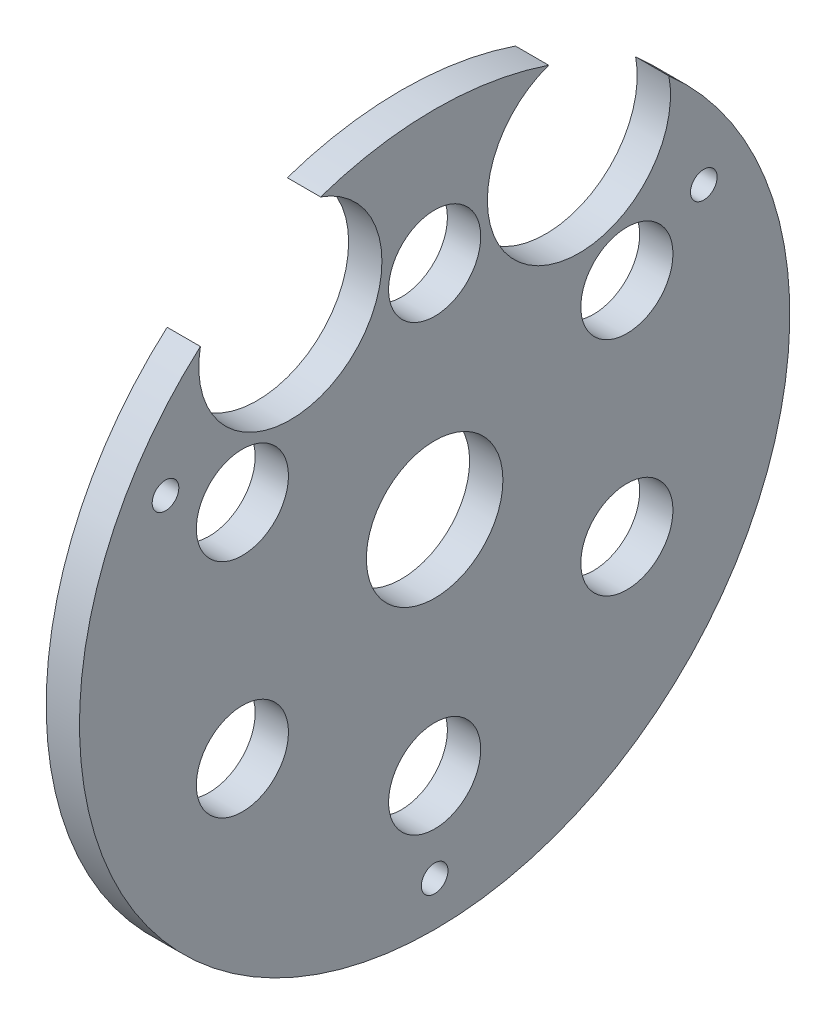
ISO-10303-21;
HEADER;
FILE_DESCRIPTION(('STEP AP214'),'2;1');
FILE_NAME('part.step','',(''),(''),'','','');
FILE_SCHEMA(('AUTOMOTIVE_DESIGN { 1 0 10303 214 1 1 1 1 }'));
ENDSEC;
DATA;
#1=APPLICATION_CONTEXT('core data for automotive mechanical design processes');
#2=APPLICATION_PROTOCOL_DEFINITION('international standard','automotive_design',2000,#1);
#3=PRODUCT_CONTEXT('',#1,'mechanical');
#4=PRODUCT('Part','Part','',(#3));
#5=PRODUCT_RELATED_PRODUCT_CATEGORY('part','',(#4));
#6=PRODUCT_DEFINITION_FORMATION('','',#4);
#7=PRODUCT_DEFINITION_CONTEXT('part definition',#1,'design');
#8=PRODUCT_DEFINITION('design','',#6,#7);
#9=PRODUCT_DEFINITION_SHAPE('','',#8);
#10=(LENGTH_UNIT() NAMED_UNIT(*) SI_UNIT(.MILLI.,.METRE.));
#11=(NAMED_UNIT(*) PLANE_ANGLE_UNIT() SI_UNIT($,.RADIAN.));
#12=(NAMED_UNIT(*) SI_UNIT($,.STERADIAN.) SOLID_ANGLE_UNIT());
#13=UNCERTAINTY_MEASURE_WITH_UNIT(LENGTH_MEASURE(1.E-05),#10,'distance_accuracy_value','');
#14=(GEOMETRIC_REPRESENTATION_CONTEXT(3) GLOBAL_UNCERTAINTY_ASSIGNED_CONTEXT((#13)) GLOBAL_UNIT_ASSIGNED_CONTEXT((#10,
#11,#12)) REPRESENTATION_CONTEXT('',''));
#15=CARTESIAN_POINT('',(0.,0.,0.));
#16=DIRECTION('',(0.,0.,1.));
#17=DIRECTION('',(1.,0.,0.));
#18=AXIS2_PLACEMENT_3D('',#15,#16,#17);
#19=CARTESIAN_POINT('',(-60.,0.,0.));
#20=DIRECTION('',(-1.,0.,0.));
#21=DIRECTION('',(0.,0.,1.));
#22=AXIS2_PLACEMENT_3D('',#19,#20,#21);
#23=CYLINDRICAL_SURFACE('',#22,32.);
#24=DIRECTION('',(-1.,0.,0.));
#25=VECTOR('',#24,1.);
#26=CARTESIAN_POINT('',(-15.5,30.3045876042156,10.2777414901535));
#27=LINE('',#26,#25);
#28=CARTESIAN_POINT('',(-14.,30.3045876042156,10.2777414901535));
#29=VERTEX_POINT('',#28);
#30=CARTESIAN_POINT('',(-17.,30.3045876042156,10.2777414901535));
#31=VERTEX_POINT('',#30);
#32=EDGE_CURVE('E11',#29,#31,#27,.T.);
#33=ORIENTED_EDGE('',*,*,#32,.F.);
#34=CARTESIAN_POINT('',(-14.,0.,0.));
#35=DIRECTION('',(-1.,0.,0.));
#36=DIRECTION('',(0.,0.,1.));
#37=AXIS2_PLACEMENT_3D('',#34,#35,#36);
#38=CIRCLE('',#37,32.);
#39=CARTESIAN_POINT('',(-14.,30.3045876042156,-10.2777414901535));
#40=VERTEX_POINT('',#39);
#41=EDGE_CURVE('E113',#29,#40,#38,.T.);
#42=ORIENTED_EDGE('',*,*,#41,.T.);
#43=DIRECTION('',(-1.,0.,0.));
#44=VECTOR('',#43,1.);
#45=CARTESIAN_POINT('',(-15.5,30.3045876042156,-10.2777414901535));
#46=LINE('',#45,#44);
#47=CARTESIAN_POINT('',(-17.,30.3045876042156,-10.2777414901535));
#48=VERTEX_POINT('',#47);
#49=EDGE_CURVE('E85',#48,#40,#46,.F.);
#50=ORIENTED_EDGE('',*,*,#49,.F.);
#51=CARTESIAN_POINT('',(-17.,0.,0.));
#52=DIRECTION('',(-1.,0.,0.));
#53=DIRECTION('',(0.,0.,1.));
#54=AXIS2_PLACEMENT_3D('',#51,#52,#53);
#55=CIRCLE('',#54,32.);
#56=EDGE_CURVE('E93',#31,#48,#55,.T.);
#57=ORIENTED_EDGE('',*,*,#56,.F.);
#58=EDGE_LOOP('',(#33,#42,#50,#57));
#59=FACE_BOUND('',#58,.T.);
#60=ADVANCED_FACE('F37',(#59),#23,.T.);
#61=DIRECTION('',(-1.,0.,0.));
#62=VECTOR('',#61,1.);
#63=CARTESIAN_POINT('',(-15.5,24.0530790261101,21.1056719713849));
#64=LINE('',#63,#62);
#65=CARTESIAN_POINT('',(-17.,24.0530790261101,21.1056719713849));
#66=VERTEX_POINT('',#65);
#67=CARTESIAN_POINT('',(-14.,24.0530790261101,21.1056719713849));
#68=VERTEX_POINT('',#67);
#69=EDGE_CURVE('E46',#66,#68,#64,.F.);
#70=ORIENTED_EDGE('',*,*,#69,.F.);
#71=CARTESIAN_POINT('',(-17.,24.0530790261101,-21.1056719713849));
#72=VERTEX_POINT('',#71);
#73=EDGE_CURVE('E91',#72,#66,#55,.T.);
#74=ORIENTED_EDGE('',*,*,#73,.F.);
#75=DIRECTION('',(-1.,0.,0.));
#76=VECTOR('',#75,1.);
#77=CARTESIAN_POINT('',(-15.5,24.0530790261101,-21.1056719713849));
#78=LINE('',#77,#76);
#79=CARTESIAN_POINT('',(-14.,24.0530790261101,-21.1056719713849));
#80=VERTEX_POINT('',#79);
#81=EDGE_CURVE('E76',#80,#72,#78,.T.);
#82=ORIENTED_EDGE('',*,*,#81,.F.);
#83=EDGE_CURVE('E104',#80,#68,#38,.T.);
#84=ORIENTED_EDGE('',*,*,#83,.T.);
#85=EDGE_LOOP('',(#70,#74,#82,#84));
#86=FACE_BOUND('',#85,.T.);
#87=ADVANCED_FACE('F97',(#86),#23,.T.);
#88=CARTESIAN_POINT('',(-17.,32.,0.));
#89=DIRECTION('',(1.,0.,0.));
#90=DIRECTION('',(0.,0.,-1.));
#91=AXIS2_PLACEMENT_3D('',#88,#89,#90);
#92=PLANE('',#91);
#93=CARTESIAN_POINT('',(-17.,14.,24.2487113059643));
#94=DIRECTION('',(1.,0.,0.));
#95=DIRECTION('',(0.,0.,-1.));
#96=AXIS2_PLACEMENT_3D('',#93,#94,#95);
#97=CIRCLE('',#96,1.2);
#98=CARTESIAN_POINT('',(-17.,14.,23.0487113059643));
#99=VERTEX_POINT('',#98);
#100=EDGE_CURVE('E219',#99,#99,#97,.T.);
#101=ORIENTED_EDGE('',*,*,#100,.T.);
#102=EDGE_LOOP('',(#101));
#103=FACE_BOUND('',#102,.T.);
#104=CARTESIAN_POINT('',(-17.,-28.,0.));
#105=DIRECTION('',(1.,0.,0.));
#106=DIRECTION('',(0.,0.,-1.));
#107=AXIS2_PLACEMENT_3D('',#104,#105,#106);
#108=CIRCLE('',#107,1.2);
#109=CARTESIAN_POINT('',(-17.,-28.,-1.2));
#110=VERTEX_POINT('',#109);
#111=EDGE_CURVE('E213',#110,#110,#108,.T.);
#112=ORIENTED_EDGE('',*,*,#111,.T.);
#113=EDGE_LOOP('',(#112));
#114=FACE_BOUND('',#113,.T.);
#115=CARTESIAN_POINT('',(-17.,14.,-24.2487113059643));
#116=DIRECTION('',(1.,0.,0.));
#117=DIRECTION('',(0.,0.,-1.));
#118=AXIS2_PLACEMENT_3D('',#115,#116,#117);
#119=CIRCLE('',#118,1.2);
#120=CARTESIAN_POINT('',(-17.,14.,-25.4487113059643));
#121=VERTEX_POINT('',#120);
#122=EDGE_CURVE('E136',#121,#121,#119,.T.);
#123=ORIENTED_EDGE('',*,*,#122,.T.);
#124=EDGE_LOOP('',(#123));
#125=FACE_BOUND('',#124,.T.);
#126=CARTESIAN_POINT('',(-17.,22.5166604983954,13.));
#127=DIRECTION('',(1.,0.,0.));
#128=DIRECTION('',(0.,0.,-1.));
#129=AXIS2_PLACEMENT_3D('',#126,#127,#128);
#130=CIRCLE('',#129,8.25);
#131=EDGE_CURVE('E60',#66,#31,#130,.T.);
#132=ORIENTED_EDGE('',*,*,#131,.T.);
#133=ORIENTED_EDGE('',*,*,#56,.T.);
#134=CARTESIAN_POINT('',(-17.,22.5166604983954,-13.));
#135=DIRECTION('',(1.,0.,0.));
#136=DIRECTION('',(0.,0.,-1.));
#137=AXIS2_PLACEMENT_3D('',#134,#135,#136);
#138=CIRCLE('',#137,8.25);
#139=EDGE_CURVE('E53',#48,#72,#138,.T.);
#140=ORIENTED_EDGE('',*,*,#139,.T.);
#141=ORIENTED_EDGE('',*,*,#73,.T.);
#142=EDGE_LOOP('',(#132,#133,#140,#141));
#143=FACE_BOUND('',#142,.T.);
#144=CARTESIAN_POINT('',(-17.,10.,-17.3205080756888));
#145=DIRECTION('',(1.,0.,0.));
#146=DIRECTION('',(0.,0.,-1.));
#147=AXIS2_PLACEMENT_3D('',#144,#145,#146);
#148=CIRCLE('',#147,4.15);
#149=CARTESIAN_POINT('',(-17.,10.,-21.4705080756888));
#150=VERTEX_POINT('',#149);
#151=EDGE_CURVE('E126',#150,#150,#148,.T.);
#152=ORIENTED_EDGE('',*,*,#151,.T.);
#153=EDGE_LOOP('',(#152));
#154=FACE_BOUND('',#153,.T.);
#155=CARTESIAN_POINT('',(-17.,-10.,-17.3205080756888));
#156=DIRECTION('',(1.,0.,0.));
#157=DIRECTION('',(0.,0.,-1.));
#158=AXIS2_PLACEMENT_3D('',#155,#156,#157);
#159=CIRCLE('',#158,4.15);
#160=CARTESIAN_POINT('',(-17.,-10.,-21.4705080756888));
#161=VERTEX_POINT('',#160);
#162=EDGE_CURVE('E175',#161,#161,#159,.T.);
#163=ORIENTED_EDGE('',*,*,#162,.T.);
#164=EDGE_LOOP('',(#163));
#165=FACE_BOUND('',#164,.T.);
#166=CARTESIAN_POINT('',(-17.,-20.,0.));
#167=DIRECTION('',(1.,0.,0.));
#168=DIRECTION('',(0.,0.,-1.));
#169=AXIS2_PLACEMENT_3D('',#166,#167,#168);
#170=CIRCLE('',#169,4.15);
#171=CARTESIAN_POINT('',(-17.,-20.,-4.15));
#172=VERTEX_POINT('',#171);
#173=EDGE_CURVE('E168',#172,#172,#170,.T.);
#174=ORIENTED_EDGE('',*,*,#173,.T.);
#175=EDGE_LOOP('',(#174));
#176=FACE_BOUND('',#175,.T.);
#177=CARTESIAN_POINT('',(-17.,-10.,17.3205080756888));
#178=DIRECTION('',(1.,0.,0.));
#179=DIRECTION('',(0.,0.,-1.));
#180=AXIS2_PLACEMENT_3D('',#177,#178,#179);
#181=CIRCLE('',#180,4.15);
#182=CARTESIAN_POINT('',(-17.,-10.,13.1705080756888));
#183=VERTEX_POINT('',#182);
#184=EDGE_CURVE('E160',#183,#183,#181,.T.);
#185=ORIENTED_EDGE('',*,*,#184,.T.);
#186=EDGE_LOOP('',(#185));
#187=FACE_BOUND('',#186,.T.);
#188=CARTESIAN_POINT('',(-17.,10.,17.3205080756888));
#189=DIRECTION('',(1.,0.,0.));
#190=DIRECTION('',(0.,0.,-1.));
#191=AXIS2_PLACEMENT_3D('',#188,#189,#190);
#192=CIRCLE('',#191,4.15);
#193=CARTESIAN_POINT('',(-17.,10.,13.1705080756888));
#194=VERTEX_POINT('',#193);
#195=EDGE_CURVE('E153',#194,#194,#192,.T.);
#196=ORIENTED_EDGE('',*,*,#195,.T.);
#197=EDGE_LOOP('',(#196));
#198=FACE_BOUND('',#197,.T.);
#199=CARTESIAN_POINT('',(-17.,20.,0.));
#200=DIRECTION('',(1.,0.,0.));
#201=DIRECTION('',(0.,0.,-1.));
#202=AXIS2_PLACEMENT_3D('',#199,#200,#201);
#203=CIRCLE('',#202,4.15);
#204=CARTESIAN_POINT('',(-17.,20.,-4.15));
#205=VERTEX_POINT('',#204);
#206=EDGE_CURVE('E145',#205,#205,#203,.T.);
#207=ORIENTED_EDGE('',*,*,#206,.T.);
#208=EDGE_LOOP('',(#207));
#209=FACE_BOUND('',#208,.T.);
#210=CARTESIAN_POINT('',(-17.,0.,0.));
#211=DIRECTION('',(1.,0.,0.));
#212=DIRECTION('',(0.,0.,-1.));
#213=AXIS2_PLACEMENT_3D('',#210,#211,#212);
#214=CIRCLE('',#213,6.15);
#215=CARTESIAN_POINT('',(-17.,0.,-6.15));
#216=VERTEX_POINT('',#215);
#217=EDGE_CURVE('E107',#216,#216,#214,.T.);
#218=ORIENTED_EDGE('',*,*,#217,.T.);
#219=EDGE_LOOP('',(#218));
#220=FACE_BOUND('',#219,.T.);
#221=ADVANCED_FACE('F39',(#103,#114,#125,#143,#154,#165,#176,#187,#198,#209,#220),#92,.F.);
#222=CARTESIAN_POINT('',(-14.,0.,0.));
#223=DIRECTION('',(-1.,0.,0.));
#224=DIRECTION('',(0.,0.,1.));
#225=AXIS2_PLACEMENT_3D('',#222,#223,#224);
#226=PLANE('',#225);
#227=CARTESIAN_POINT('',(-14.,14.,24.2487113059643));
#228=DIRECTION('',(1.,0.,0.));
#229=DIRECTION('',(0.,0.,-1.));
#230=AXIS2_PLACEMENT_3D('',#227,#228,#229);
#231=CIRCLE('',#230,1.2);
#232=CARTESIAN_POINT('',(-14.,14.,23.0487113059643));
#233=VERTEX_POINT('',#232);
#234=EDGE_CURVE('E95',#233,#233,#231,.T.);
#235=ORIENTED_EDGE('',*,*,#234,.F.);
#236=EDGE_LOOP('',(#235));
#237=FACE_BOUND('',#236,.T.);
#238=CARTESIAN_POINT('',(-14.,-28.,0.));
#239=DIRECTION('',(1.,0.,0.));
#240=DIRECTION('',(0.,0.,-1.));
#241=AXIS2_PLACEMENT_3D('',#238,#239,#240);
#242=CIRCLE('',#241,1.2);
#243=CARTESIAN_POINT('',(-14.,-28.,-1.2));
#244=VERTEX_POINT('',#243);
#245=EDGE_CURVE('E215',#244,#244,#242,.T.);
#246=ORIENTED_EDGE('',*,*,#245,.F.);
#247=EDGE_LOOP('',(#246));
#248=FACE_BOUND('',#247,.T.);
#249=CARTESIAN_POINT('',(-14.,14.,-24.2487113059643));
#250=DIRECTION('',(1.,0.,0.));
#251=DIRECTION('',(0.,0.,-1.));
#252=AXIS2_PLACEMENT_3D('',#249,#250,#251);
#253=CIRCLE('',#252,1.2);
#254=CARTESIAN_POINT('',(-14.,14.,-25.4487113059643));
#255=VERTEX_POINT('',#254);
#256=EDGE_CURVE('E210',#255,#255,#253,.T.);
#257=ORIENTED_EDGE('',*,*,#256,.F.);
#258=EDGE_LOOP('',(#257));
#259=FACE_BOUND('',#258,.T.);
#260=CARTESIAN_POINT('',(-14.,22.5166604983954,13.));
#261=DIRECTION('',(1.,0.,0.));
#262=DIRECTION('',(0.,0.,-1.));
#263=AXIS2_PLACEMENT_3D('',#260,#261,#262);
#264=CIRCLE('',#263,8.25);
#265=EDGE_CURVE('E118',#68,#29,#264,.T.);
#266=ORIENTED_EDGE('',*,*,#265,.F.);
#267=ORIENTED_EDGE('',*,*,#83,.F.);
#268=CARTESIAN_POINT('',(-14.,22.5166604983954,-13.));
#269=DIRECTION('',(1.,0.,0.));
#270=DIRECTION('',(0.,0.,-1.));
#271=AXIS2_PLACEMENT_3D('',#268,#269,#270);
#272=CIRCLE('',#271,8.25);
#273=EDGE_CURVE('E79',#40,#80,#272,.T.);
#274=ORIENTED_EDGE('',*,*,#273,.F.);
#275=ORIENTED_EDGE('',*,*,#41,.F.);
#276=EDGE_LOOP('',(#266,#267,#274,#275));
#277=FACE_BOUND('',#276,.T.);
#278=CARTESIAN_POINT('',(-14.,10.,-17.3205080756888));
#279=DIRECTION('',(1.,0.,0.));
#280=DIRECTION('',(0.,0.,-1.));
#281=AXIS2_PLACEMENT_3D('',#278,#279,#280);
#282=CIRCLE('',#281,4.15);
#283=CARTESIAN_POINT('',(-14.,10.,-21.4705080756888));
#284=VERTEX_POINT('',#283);
#285=EDGE_CURVE('E131',#284,#284,#282,.T.);
#286=ORIENTED_EDGE('',*,*,#285,.F.);
#287=EDGE_LOOP('',(#286));
#288=FACE_BOUND('',#287,.T.);
#289=CARTESIAN_POINT('',(-14.,-10.,-17.3205080756888));
#290=DIRECTION('',(1.,0.,0.));
#291=DIRECTION('',(0.,0.,-1.));
#292=AXIS2_PLACEMENT_3D('',#289,#290,#291);
#293=CIRCLE('',#292,4.15);
#294=CARTESIAN_POINT('',(-14.,-10.,-21.4705080756888));
#295=VERTEX_POINT('',#294);
#296=EDGE_CURVE('E172',#295,#295,#293,.T.);
#297=ORIENTED_EDGE('',*,*,#296,.F.);
#298=EDGE_LOOP('',(#297));
#299=FACE_BOUND('',#298,.T.);
#300=CARTESIAN_POINT('',(-14.,-20.,0.));
#301=DIRECTION('',(1.,0.,0.));
#302=DIRECTION('',(0.,0.,-1.));
#303=AXIS2_PLACEMENT_3D('',#300,#301,#302);
#304=CIRCLE('',#303,4.15);
#305=CARTESIAN_POINT('',(-14.,-20.,-4.15));
#306=VERTEX_POINT('',#305);
#307=EDGE_CURVE('E164',#306,#306,#304,.T.);
#308=ORIENTED_EDGE('',*,*,#307,.F.);
#309=EDGE_LOOP('',(#308));
#310=FACE_BOUND('',#309,.T.);
#311=CARTESIAN_POINT('',(-14.,-10.,17.3205080756888));
#312=DIRECTION('',(1.,0.,0.));
#313=DIRECTION('',(0.,0.,-1.));
#314=AXIS2_PLACEMENT_3D('',#311,#312,#313);
#315=CIRCLE('',#314,4.15);
#316=CARTESIAN_POINT('',(-14.,-10.,13.1705080756888));
#317=VERTEX_POINT('',#316);
#318=EDGE_CURVE('E157',#317,#317,#315,.T.);
#319=ORIENTED_EDGE('',*,*,#318,.F.);
#320=EDGE_LOOP('',(#319));
#321=FACE_BOUND('',#320,.T.);
#322=CARTESIAN_POINT('',(-14.,10.,17.3205080756888));
#323=DIRECTION('',(1.,0.,0.));
#324=DIRECTION('',(0.,0.,-1.));
#325=AXIS2_PLACEMENT_3D('',#322,#323,#324);
#326=CIRCLE('',#325,4.15);
#327=CARTESIAN_POINT('',(-14.,10.,13.1705080756888));
#328=VERTEX_POINT('',#327);
#329=EDGE_CURVE('E149',#328,#328,#326,.T.);
#330=ORIENTED_EDGE('',*,*,#329,.F.);
#331=EDGE_LOOP('',(#330));
#332=FACE_BOUND('',#331,.T.);
#333=CARTESIAN_POINT('',(-14.,20.,0.));
#334=DIRECTION('',(1.,0.,0.));
#335=DIRECTION('',(0.,0.,-1.));
#336=AXIS2_PLACEMENT_3D('',#333,#334,#335);
#337=CIRCLE('',#336,4.15);
#338=CARTESIAN_POINT('',(-14.,20.,-4.15));
#339=VERTEX_POINT('',#338);
#340=EDGE_CURVE('E141',#339,#339,#337,.T.);
#341=ORIENTED_EDGE('',*,*,#340,.F.);
#342=EDGE_LOOP('',(#341));
#343=FACE_BOUND('',#342,.T.);
#344=CARTESIAN_POINT('',(-14.,0.,0.));
#345=DIRECTION('',(1.,0.,0.));
#346=DIRECTION('',(0.,0.,-1.));
#347=AXIS2_PLACEMENT_3D('',#344,#345,#346);
#348=CIRCLE('',#347,6.15);
#349=CARTESIAN_POINT('',(-14.,0.,-6.15));
#350=VERTEX_POINT('',#349);
#351=EDGE_CURVE('E99',#350,#350,#348,.T.);
#352=ORIENTED_EDGE('',*,*,#351,.F.);
#353=EDGE_LOOP('',(#352));
#354=FACE_BOUND('',#353,.T.);
#355=ADVANCED_FACE('F122',(#237,#248,#259,#277,#288,#299,#310,#321,#332,#343,#354),#226,.F.);
#356=CARTESIAN_POINT('',(-14.,0.,0.));
#357=DIRECTION('',(-1.,0.,0.));
#358=DIRECTION('',(0.,0.,1.));
#359=AXIS2_PLACEMENT_3D('',#356,#357,#358);
#360=CYLINDRICAL_SURFACE('',#359,6.15);
#361=ORIENTED_EDGE('',*,*,#351,.T.);
#362=EDGE_LOOP('',(#361));
#363=FACE_BOUND('',#362,.T.);
#364=ORIENTED_EDGE('',*,*,#217,.F.);
#365=EDGE_LOOP('',(#364));
#366=FACE_BOUND('',#365,.T.);
#367=ADVANCED_FACE('F188',(#363,#366),#360,.F.);
#368=CARTESIAN_POINT('',(-14.,20.,0.));
#369=DIRECTION('',(-1.,0.,0.));
#370=DIRECTION('',(0.,0.,1.));
#371=AXIS2_PLACEMENT_3D('',#368,#369,#370);
#372=CYLINDRICAL_SURFACE('',#371,4.15);
#373=ORIENTED_EDGE('',*,*,#340,.T.);
#374=EDGE_LOOP('',(#373));
#375=FACE_BOUND('',#374,.T.);
#376=ORIENTED_EDGE('',*,*,#206,.F.);
#377=EDGE_LOOP('',(#376));
#378=FACE_BOUND('',#377,.T.);
#379=ADVANCED_FACE('F204',(#375,#378),#372,.F.);
#380=CARTESIAN_POINT('',(-14.,10.,17.3205080756888));
#381=DIRECTION('',(-1.,0.,0.));
#382=DIRECTION('',(0.,0.,1.));
#383=AXIS2_PLACEMENT_3D('',#380,#381,#382);
#384=CYLINDRICAL_SURFACE('',#383,4.15);
#385=ORIENTED_EDGE('',*,*,#329,.T.);
#386=EDGE_LOOP('',(#385));
#387=FACE_BOUND('',#386,.T.);
#388=ORIENTED_EDGE('',*,*,#195,.F.);
#389=EDGE_LOOP('',(#388));
#390=FACE_BOUND('',#389,.T.);
#391=ADVANCED_FACE('F265',(#387,#390),#384,.F.);
#392=CARTESIAN_POINT('',(-14.,-10.,17.3205080756888));
#393=DIRECTION('',(-1.,0.,0.));
#394=DIRECTION('',(0.,0.,1.));
#395=AXIS2_PLACEMENT_3D('',#392,#393,#394);
#396=CYLINDRICAL_SURFACE('',#395,4.15);
#397=ORIENTED_EDGE('',*,*,#318,.T.);
#398=EDGE_LOOP('',(#397));
#399=FACE_BOUND('',#398,.T.);
#400=ORIENTED_EDGE('',*,*,#184,.F.);
#401=EDGE_LOOP('',(#400));
#402=FACE_BOUND('',#401,.T.);
#403=ADVANCED_FACE('F261',(#399,#402),#396,.F.);
#404=CARTESIAN_POINT('',(-14.,-20.,0.));
#405=DIRECTION('',(-1.,0.,0.));
#406=DIRECTION('',(0.,0.,1.));
#407=AXIS2_PLACEMENT_3D('',#404,#405,#406);
#408=CYLINDRICAL_SURFACE('',#407,4.15);
#409=ORIENTED_EDGE('',*,*,#307,.T.);
#410=EDGE_LOOP('',(#409));
#411=FACE_BOUND('',#410,.T.);
#412=ORIENTED_EDGE('',*,*,#173,.F.);
#413=EDGE_LOOP('',(#412));
#414=FACE_BOUND('',#413,.T.);
#415=ADVANCED_FACE('F257',(#411,#414),#408,.F.);
#416=CARTESIAN_POINT('',(-14.,-10.,-17.3205080756888));
#417=DIRECTION('',(-1.,0.,0.));
#418=DIRECTION('',(0.,0.,1.));
#419=AXIS2_PLACEMENT_3D('',#416,#417,#418);
#420=CYLINDRICAL_SURFACE('',#419,4.15);
#421=ORIENTED_EDGE('',*,*,#296,.T.);
#422=EDGE_LOOP('',(#421));
#423=FACE_BOUND('',#422,.T.);
#424=ORIENTED_EDGE('',*,*,#162,.F.);
#425=EDGE_LOOP('',(#424));
#426=FACE_BOUND('',#425,.T.);
#427=ADVANCED_FACE('F254',(#423,#426),#420,.F.);
#428=CARTESIAN_POINT('',(-14.,10.,-17.3205080756888));
#429=DIRECTION('',(-1.,0.,0.));
#430=DIRECTION('',(0.,0.,1.));
#431=AXIS2_PLACEMENT_3D('',#428,#429,#430);
#432=CYLINDRICAL_SURFACE('',#431,4.15);
#433=ORIENTED_EDGE('',*,*,#285,.T.);
#434=EDGE_LOOP('',(#433));
#435=FACE_BOUND('',#434,.T.);
#436=ORIENTED_EDGE('',*,*,#151,.F.);
#437=EDGE_LOOP('',(#436));
#438=FACE_BOUND('',#437,.T.);
#439=ADVANCED_FACE('F184',(#435,#438),#432,.F.);
#440=CARTESIAN_POINT('',(-14.,22.5166604983954,-13.));
#441=DIRECTION('',(-1.,0.,0.));
#442=DIRECTION('',(0.,0.,1.));
#443=AXIS2_PLACEMENT_3D('',#440,#441,#442);
#444=CYLINDRICAL_SURFACE('',#443,8.25);
#445=ORIENTED_EDGE('',*,*,#81,.T.);
#446=ORIENTED_EDGE('',*,*,#139,.F.);
#447=ORIENTED_EDGE('',*,*,#49,.T.);
#448=ORIENTED_EDGE('',*,*,#273,.T.);
#449=EDGE_LOOP('',(#445,#446,#447,#448));
#450=FACE_BOUND('',#449,.T.);
#451=ADVANCED_FACE('F77',(#450),#444,.F.);
#452=CARTESIAN_POINT('',(-14.,22.5166604983954,13.));
#453=DIRECTION('',(-1.,0.,0.));
#454=DIRECTION('',(0.,0.,1.));
#455=AXIS2_PLACEMENT_3D('',#452,#453,#454);
#456=CYLINDRICAL_SURFACE('',#455,8.25);
#457=ORIENTED_EDGE('',*,*,#32,.T.);
#458=ORIENTED_EDGE('',*,*,#131,.F.);
#459=ORIENTED_EDGE('',*,*,#69,.T.);
#460=ORIENTED_EDGE('',*,*,#265,.T.);
#461=EDGE_LOOP('',(#457,#458,#459,#460));
#462=FACE_BOUND('',#461,.T.);
#463=ADVANCED_FACE('F117',(#462),#456,.F.);
#464=CARTESIAN_POINT('',(-14.,14.,-24.2487113059643));
#465=DIRECTION('',(-1.,0.,0.));
#466=DIRECTION('',(0.,0.,1.));
#467=AXIS2_PLACEMENT_3D('',#464,#465,#466);
#468=CYLINDRICAL_SURFACE('',#467,1.2);
#469=ORIENTED_EDGE('',*,*,#256,.T.);
#470=EDGE_LOOP('',(#469));
#471=FACE_BOUND('',#470,.T.);
#472=ORIENTED_EDGE('',*,*,#122,.F.);
#473=EDGE_LOOP('',(#472));
#474=FACE_BOUND('',#473,.T.);
#475=ADVANCED_FACE('F236',(#471,#474),#468,.F.);
#476=CARTESIAN_POINT('',(-14.,-28.,0.));
#477=DIRECTION('',(-1.,0.,0.));
#478=DIRECTION('',(0.,0.,1.));
#479=AXIS2_PLACEMENT_3D('',#476,#477,#478);
#480=CYLINDRICAL_SURFACE('',#479,1.2);
#481=ORIENTED_EDGE('',*,*,#245,.T.);
#482=EDGE_LOOP('',(#481));
#483=FACE_BOUND('',#482,.T.);
#484=ORIENTED_EDGE('',*,*,#111,.F.);
#485=EDGE_LOOP('',(#484));
#486=FACE_BOUND('',#485,.T.);
#487=ADVANCED_FACE('F230',(#483,#486),#480,.F.);
#488=CARTESIAN_POINT('',(-14.,14.,24.2487113059643));
#489=DIRECTION('',(-1.,0.,0.));
#490=DIRECTION('',(0.,0.,1.));
#491=AXIS2_PLACEMENT_3D('',#488,#489,#490);
#492=CYLINDRICAL_SURFACE('',#491,1.2);
#493=ORIENTED_EDGE('',*,*,#234,.T.);
#494=EDGE_LOOP('',(#493));
#495=FACE_BOUND('',#494,.T.);
#496=ORIENTED_EDGE('',*,*,#100,.F.);
#497=EDGE_LOOP('',(#496));
#498=FACE_BOUND('',#497,.T.);
#499=ADVANCED_FACE('F279',(#495,#498),#492,.F.);
#500=CLOSED_SHELL('',(#60,#87,#221,#355,#367,#379,#391,#403,#415,#427,#439,#451,#463,#475,#487,#499));
#501=MANIFOLD_SOLID_BREP('B2',#500);
#502=ADVANCED_BREP_SHAPE_REPRESENTATION('',(#18,#501),#14);
#503=SHAPE_DEFINITION_REPRESENTATION(#9,#502);
ENDSEC;
END-ISO-10303-21;
